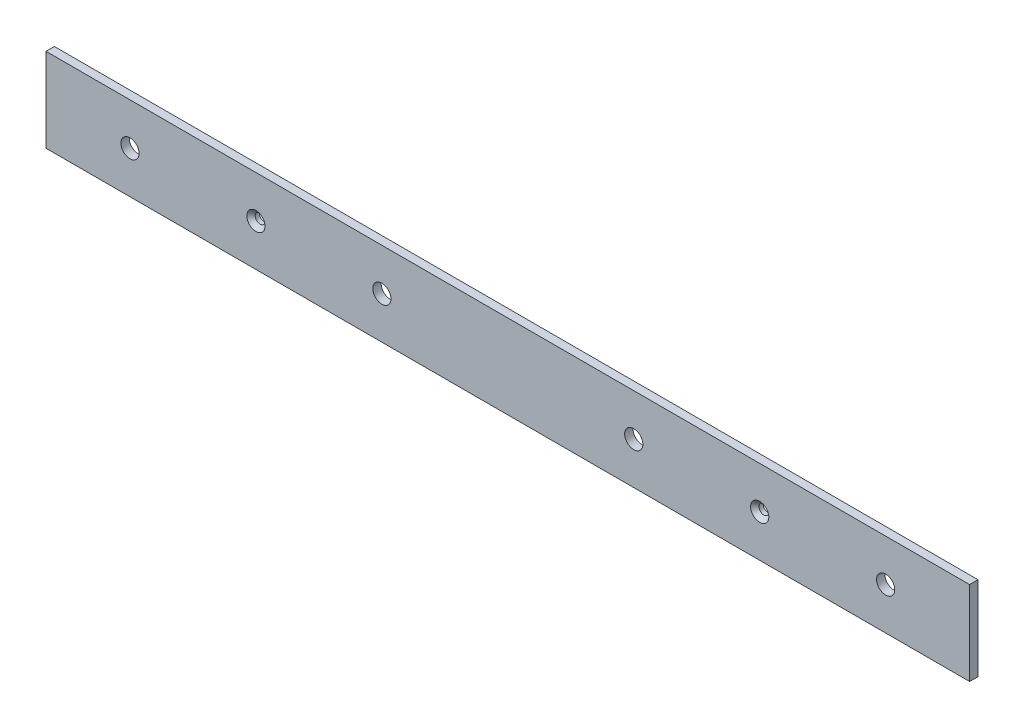
ISO-10303-21;
HEADER;
FILE_DESCRIPTION(('STEP AP214'),'2;1');
FILE_NAME('part.step','',(''),(''),'','','');
FILE_SCHEMA(('AUTOMOTIVE_DESIGN { 1 0 10303 214 1 1 1 1 }'));
ENDSEC;
DATA;
#1=APPLICATION_CONTEXT('core data for automotive mechanical design processes');
#2=APPLICATION_PROTOCOL_DEFINITION('international standard','automotive_design',2000,#1);
#3=PRODUCT_CONTEXT('',#1,'mechanical');
#4=PRODUCT('Part','Part','',(#3));
#5=PRODUCT_RELATED_PRODUCT_CATEGORY('part','',(#4));
#6=PRODUCT_DEFINITION_FORMATION('','',#4);
#7=PRODUCT_DEFINITION_CONTEXT('part definition',#1,'design');
#8=PRODUCT_DEFINITION('design','',#6,#7);
#9=PRODUCT_DEFINITION_SHAPE('','',#8);
#10=(LENGTH_UNIT() NAMED_UNIT(*) SI_UNIT(.MILLI.,.METRE.));
#11=(NAMED_UNIT(*) PLANE_ANGLE_UNIT() SI_UNIT($,.RADIAN.));
#12=(NAMED_UNIT(*) SI_UNIT($,.STERADIAN.) SOLID_ANGLE_UNIT());
#13=UNCERTAINTY_MEASURE_WITH_UNIT(LENGTH_MEASURE(1.E-05),#10,'distance_accuracy_value','');
#14=(GEOMETRIC_REPRESENTATION_CONTEXT(3) GLOBAL_UNCERTAINTY_ASSIGNED_CONTEXT((#13)) GLOBAL_UNIT_ASSIGNED_CONTEXT((#10,
#11,#12)) REPRESENTATION_CONTEXT('',''));
#15=CARTESIAN_POINT('',(0.,0.,0.));
#16=DIRECTION('',(0.,0.,1.));
#17=DIRECTION('',(1.,0.,0.));
#18=AXIS2_PLACEMENT_3D('',#15,#16,#17);
#19=CARTESIAN_POINT('',(-165.,-15.,3.));
#20=DIRECTION('',(0.,0.,-1.));
#21=DIRECTION('',(-1.,0.,0.));
#22=AXIS2_PLACEMENT_3D('',#19,#20,#21);
#23=PLANE('',#22);
#24=CARTESIAN_POINT('',(-90.,0.,3.));
#25=DIRECTION('',(0.,0.,-1.));
#26=DIRECTION('',(-1.,0.,0.));
#27=AXIS2_PLACEMENT_3D('',#24,#25,#26);
#28=CIRCLE('',#27,3.24999999999998);
#29=CARTESIAN_POINT('',(-93.25,0.,3.));
#30=VERTEX_POINT('',#29);
#31=EDGE_CURVE('E40',#30,#30,#28,.T.);
#32=ORIENTED_EDGE('',*,*,#31,.T.);
#33=EDGE_LOOP('',(#32));
#34=FACE_BOUND('',#33,.T.);
#35=CARTESIAN_POINT('',(90.,0.,3.));
#36=DIRECTION('',(0.,0.,-1.));
#37=DIRECTION('',(-1.,0.,0.));
#38=AXIS2_PLACEMENT_3D('',#35,#36,#37);
#39=CIRCLE('',#38,3.24999999999998);
#40=CARTESIAN_POINT('',(86.75,0.,3.));
#41=VERTEX_POINT('',#40);
#42=EDGE_CURVE('E112',#41,#41,#39,.T.);
#43=ORIENTED_EDGE('',*,*,#42,.T.);
#44=EDGE_LOOP('',(#43));
#45=FACE_BOUND('',#44,.T.);
#46=CARTESIAN_POINT('',(45.,0.,3.));
#47=DIRECTION('',(0.,0.,1.));
#48=DIRECTION('',(1.,0.,0.));
#49=AXIS2_PLACEMENT_3D('',#46,#47,#48);
#50=CIRCLE('',#49,3.25);
#51=CARTESIAN_POINT('',(48.25,0.,3.));
#52=VERTEX_POINT('',#51);
#53=EDGE_CURVE('E148',#52,#52,#50,.T.);
#54=ORIENTED_EDGE('',*,*,#53,.F.);
#55=EDGE_LOOP('',(#54));
#56=FACE_BOUND('',#55,.T.);
#57=CARTESIAN_POINT('',(135.,0.,3.));
#58=DIRECTION('',(0.,0.,1.));
#59=DIRECTION('',(1.,0.,0.));
#60=AXIS2_PLACEMENT_3D('',#57,#58,#59);
#61=CIRCLE('',#60,3.25000000000001);
#62=CARTESIAN_POINT('',(138.25,0.,3.));
#63=VERTEX_POINT('',#62);
#64=EDGE_CURVE('E102',#63,#63,#61,.T.);
#65=ORIENTED_EDGE('',*,*,#64,.F.);
#66=EDGE_LOOP('',(#65));
#67=FACE_BOUND('',#66,.T.);
#68=DIRECTION('',(0.,-1.,0.));
#69=VECTOR('',#68,1.);
#70=CARTESIAN_POINT('',(-165.,-15.,3.));
#71=LINE('',#70,#69);
#72=CARTESIAN_POINT('',(-165.,15.,3.));
#73=VERTEX_POINT('',#72);
#74=CARTESIAN_POINT('',(-165.,-15.,3.));
#75=VERTEX_POINT('',#74);
#76=EDGE_CURVE('E84',#73,#75,#71,.T.);
#77=ORIENTED_EDGE('',*,*,#76,.T.);
#78=DIRECTION('',(1.,0.,0.));
#79=VECTOR('',#78,1.);
#80=CARTESIAN_POINT('',(-165.,-15.,3.));
#81=LINE('',#80,#79);
#82=CARTESIAN_POINT('',(165.,-15.,3.));
#83=VERTEX_POINT('',#82);
#84=EDGE_CURVE('E79',#75,#83,#81,.T.);
#85=ORIENTED_EDGE('',*,*,#84,.T.);
#86=DIRECTION('',(0.,1.,0.));
#87=VECTOR('',#86,1.);
#88=CARTESIAN_POINT('',(165.,-15.,3.));
#89=LINE('',#88,#87);
#90=CARTESIAN_POINT('',(165.,15.,3.));
#91=VERTEX_POINT('',#90);
#92=EDGE_CURVE('E82',#83,#91,#89,.T.);
#93=ORIENTED_EDGE('',*,*,#92,.T.);
#94=DIRECTION('',(-1.,0.,0.));
#95=VECTOR('',#94,1.);
#96=CARTESIAN_POINT('',(-165.,15.,3.));
#97=LINE('',#96,#95);
#98=EDGE_CURVE('E48',#91,#73,#97,.T.);
#99=ORIENTED_EDGE('',*,*,#98,.T.);
#100=EDGE_LOOP('',(#77,#85,#93,#99));
#101=FACE_BOUND('',#100,.T.);
#102=CARTESIAN_POINT('',(-45.,0.,3.));
#103=DIRECTION('',(0.,0.,1.));
#104=DIRECTION('',(-1.,0.,0.));
#105=AXIS2_PLACEMENT_3D('',#102,#103,#104);
#106=CIRCLE('',#105,3.25);
#107=CARTESIAN_POINT('',(-48.25,0.,3.));
#108=VERTEX_POINT('',#107);
#109=EDGE_CURVE('E138',#108,#108,#106,.T.);
#110=ORIENTED_EDGE('',*,*,#109,.F.);
#111=EDGE_LOOP('',(#110));
#112=FACE_BOUND('',#111,.T.);
#113=CARTESIAN_POINT('',(-135.,0.,3.));
#114=DIRECTION('',(0.,0.,1.));
#115=DIRECTION('',(-1.,0.,0.));
#116=AXIS2_PLACEMENT_3D('',#113,#114,#115);
#117=CIRCLE('',#116,3.25000000000001);
#118=CARTESIAN_POINT('',(-138.25,0.,3.));
#119=VERTEX_POINT('',#118);
#120=EDGE_CURVE('E135',#119,#119,#117,.T.);
#121=ORIENTED_EDGE('',*,*,#120,.F.);
#122=EDGE_LOOP('',(#121));
#123=FACE_BOUND('',#122,.T.);
#124=ADVANCED_FACE('F31',(#34,#45,#56,#67,#101,#112,#123),#23,.F.);
#125=CARTESIAN_POINT('',(-165.,-15.,0.));
#126=DIRECTION('',(0.,0.,-1.));
#127=DIRECTION('',(-1.,0.,0.));
#128=AXIS2_PLACEMENT_3D('',#125,#126,#127);
#129=PLANE('',#128);
#130=CARTESIAN_POINT('',(-90.,0.,0.));
#131=DIRECTION('',(0.,0.,1.));
#132=DIRECTION('',(-1.,0.,0.));
#133=AXIS2_PLACEMENT_3D('',#130,#131,#132);
#134=CIRCLE('',#133,1.75);
#135=CARTESIAN_POINT('',(-91.75,0.,0.));
#136=VERTEX_POINT('',#135);
#137=EDGE_CURVE('E132',#136,#136,#134,.T.);
#138=ORIENTED_EDGE('',*,*,#137,.T.);
#139=EDGE_LOOP('',(#138));
#140=FACE_BOUND('',#139,.T.);
#141=CARTESIAN_POINT('',(45.,0.,0.));
#142=DIRECTION('',(0.,0.,1.));
#143=DIRECTION('',(1.,0.,0.));
#144=AXIS2_PLACEMENT_3D('',#141,#142,#143);
#145=CIRCLE('',#144,3.25);
#146=CARTESIAN_POINT('',(48.25,0.,0.));
#147=VERTEX_POINT('',#146);
#148=EDGE_CURVE('E146',#147,#147,#145,.T.);
#149=ORIENTED_EDGE('',*,*,#148,.T.);
#150=EDGE_LOOP('',(#149));
#151=FACE_BOUND('',#150,.T.);
#152=CARTESIAN_POINT('',(135.,0.,0.));
#153=DIRECTION('',(0.,0.,1.));
#154=DIRECTION('',(1.,0.,0.));
#155=AXIS2_PLACEMENT_3D('',#152,#153,#154);
#156=CIRCLE('',#155,3.25000000000001);
#157=CARTESIAN_POINT('',(138.25,0.,0.));
#158=VERTEX_POINT('',#157);
#159=EDGE_CURVE('E156',#158,#158,#156,.T.);
#160=ORIENTED_EDGE('',*,*,#159,.T.);
#161=EDGE_LOOP('',(#160));
#162=FACE_BOUND('',#161,.T.);
#163=DIRECTION('',(0.,-1.,0.));
#164=VECTOR('',#163,1.);
#165=CARTESIAN_POINT('',(-165.,-15.,0.));
#166=LINE('',#165,#164);
#167=CARTESIAN_POINT('',(-165.,15.,0.));
#168=VERTEX_POINT('',#167);
#169=CARTESIAN_POINT('',(-165.,-15.,0.));
#170=VERTEX_POINT('',#169);
#171=EDGE_CURVE('E99',#168,#170,#166,.T.);
#172=ORIENTED_EDGE('',*,*,#171,.F.);
#173=DIRECTION('',(-1.,0.,0.));
#174=VECTOR('',#173,1.);
#175=CARTESIAN_POINT('',(-165.,15.,0.));
#176=LINE('',#175,#174);
#177=CARTESIAN_POINT('',(165.,15.,0.));
#178=VERTEX_POINT('',#177);
#179=EDGE_CURVE('E71',#178,#168,#176,.T.);
#180=ORIENTED_EDGE('',*,*,#179,.F.);
#181=DIRECTION('',(0.,1.,0.));
#182=VECTOR('',#181,1.);
#183=CARTESIAN_POINT('',(165.,-15.,0.));
#184=LINE('',#183,#182);
#185=CARTESIAN_POINT('',(165.,-15.,0.));
#186=VERTEX_POINT('',#185);
#187=EDGE_CURVE('E65',#186,#178,#184,.T.);
#188=ORIENTED_EDGE('',*,*,#187,.F.);
#189=DIRECTION('',(1.,0.,0.));
#190=VECTOR('',#189,1.);
#191=CARTESIAN_POINT('',(-165.,-15.,0.));
#192=LINE('',#191,#190);
#193=EDGE_CURVE('E89',#170,#186,#192,.T.);
#194=ORIENTED_EDGE('',*,*,#193,.F.);
#195=EDGE_LOOP('',(#172,#180,#188,#194));
#196=FACE_BOUND('',#195,.T.);
#197=CARTESIAN_POINT('',(90.,0.,0.));
#198=DIRECTION('',(0.,0.,1.));
#199=DIRECTION('',(1.,0.,0.));
#200=AXIS2_PLACEMENT_3D('',#197,#198,#199);
#201=CIRCLE('',#200,1.75);
#202=CARTESIAN_POINT('',(91.75,0.,0.));
#203=VERTEX_POINT('',#202);
#204=EDGE_CURVE('E151',#203,#203,#201,.T.);
#205=ORIENTED_EDGE('',*,*,#204,.T.);
#206=EDGE_LOOP('',(#205));
#207=FACE_BOUND('',#206,.T.);
#208=CARTESIAN_POINT('',(-45.,0.,0.));
#209=DIRECTION('',(0.,0.,1.));
#210=DIRECTION('',(-1.,0.,0.));
#211=AXIS2_PLACEMENT_3D('',#208,#209,#210);
#212=CIRCLE('',#211,3.25);
#213=CARTESIAN_POINT('',(-48.25,0.,0.));
#214=VERTEX_POINT('',#213);
#215=EDGE_CURVE('E134',#214,#214,#212,.T.);
#216=ORIENTED_EDGE('',*,*,#215,.T.);
#217=EDGE_LOOP('',(#216));
#218=FACE_BOUND('',#217,.T.);
#219=CARTESIAN_POINT('',(-135.,0.,0.));
#220=DIRECTION('',(0.,0.,1.));
#221=DIRECTION('',(-1.,0.,0.));
#222=AXIS2_PLACEMENT_3D('',#219,#220,#221);
#223=CIRCLE('',#222,3.25000000000001);
#224=CARTESIAN_POINT('',(-138.25,0.,0.));
#225=VERTEX_POINT('',#224);
#226=EDGE_CURVE('E141',#225,#225,#223,.T.);
#227=ORIENTED_EDGE('',*,*,#226,.T.);
#228=EDGE_LOOP('',(#227));
#229=FACE_BOUND('',#228,.T.);
#230=ADVANCED_FACE('F162',(#140,#151,#162,#196,#207,#218,#229),#129,.T.);
#231=CARTESIAN_POINT('',(-165.,-15.,3.));
#232=DIRECTION('',(1.,0.,0.));
#233=DIRECTION('',(0.,0.,-1.));
#234=AXIS2_PLACEMENT_3D('',#231,#232,#233);
#235=PLANE('',#234);
#236=ORIENTED_EDGE('',*,*,#171,.T.);
#237=DIRECTION('',(0.,0.,-1.));
#238=VECTOR('',#237,1.);
#239=CARTESIAN_POINT('',(-165.,-15.,3.));
#240=LINE('',#239,#238);
#241=EDGE_CURVE('E90',#75,#170,#240,.T.);
#242=ORIENTED_EDGE('',*,*,#241,.F.);
#243=ORIENTED_EDGE('',*,*,#76,.F.);
#244=DIRECTION('',(0.,0.,-1.));
#245=VECTOR('',#244,1.);
#246=CARTESIAN_POINT('',(-165.,15.,3.));
#247=LINE('',#246,#245);
#248=EDGE_CURVE('E95',#73,#168,#247,.T.);
#249=ORIENTED_EDGE('',*,*,#248,.T.);
#250=EDGE_LOOP('',(#236,#242,#243,#249));
#251=FACE_BOUND('',#250,.T.);
#252=ADVANCED_FACE('F184',(#251),#235,.F.);
#253=CARTESIAN_POINT('',(-165.,-15.,3.));
#254=DIRECTION('',(0.,1.,0.));
#255=DIRECTION('',(0.,0.,1.));
#256=AXIS2_PLACEMENT_3D('',#253,#254,#255);
#257=PLANE('',#256);
#258=ORIENTED_EDGE('',*,*,#193,.T.);
#259=DIRECTION('',(0.,0.,-1.));
#260=VECTOR('',#259,1.);
#261=CARTESIAN_POINT('',(165.,-15.,3.));
#262=LINE('',#261,#260);
#263=EDGE_CURVE('E87',#83,#186,#262,.T.);
#264=ORIENTED_EDGE('',*,*,#263,.F.);
#265=ORIENTED_EDGE('',*,*,#84,.F.);
#266=ORIENTED_EDGE('',*,*,#241,.T.);
#267=EDGE_LOOP('',(#258,#264,#265,#266));
#268=FACE_BOUND('',#267,.T.);
#269=ADVANCED_FACE('F88',(#268),#257,.F.);
#270=CARTESIAN_POINT('',(165.,-15.,3.));
#271=DIRECTION('',(-1.,0.,0.));
#272=DIRECTION('',(0.,0.,1.));
#273=AXIS2_PLACEMENT_3D('',#270,#271,#272);
#274=PLANE('',#273);
#275=ORIENTED_EDGE('',*,*,#187,.T.);
#276=DIRECTION('',(0.,0.,-1.));
#277=VECTOR('',#276,1.);
#278=CARTESIAN_POINT('',(165.,15.,3.));
#279=LINE('',#278,#277);
#280=EDGE_CURVE('E91',#91,#178,#279,.T.);
#281=ORIENTED_EDGE('',*,*,#280,.F.);
#282=ORIENTED_EDGE('',*,*,#92,.F.);
#283=ORIENTED_EDGE('',*,*,#263,.T.);
#284=EDGE_LOOP('',(#275,#281,#282,#283));
#285=FACE_BOUND('',#284,.T.);
#286=ADVANCED_FACE('F93',(#285),#274,.F.);
#287=CARTESIAN_POINT('',(-165.,15.,3.));
#288=DIRECTION('',(0.,-1.,0.));
#289=DIRECTION('',(1.,0.,0.));
#290=AXIS2_PLACEMENT_3D('',#287,#288,#289);
#291=PLANE('',#290);
#292=ORIENTED_EDGE('',*,*,#179,.T.);
#293=ORIENTED_EDGE('',*,*,#248,.F.);
#294=ORIENTED_EDGE('',*,*,#98,.F.);
#295=ORIENTED_EDGE('',*,*,#280,.T.);
#296=EDGE_LOOP('',(#292,#293,#294,#295));
#297=FACE_BOUND('',#296,.T.);
#298=ADVANCED_FACE('F168',(#297),#291,.F.);
#299=CARTESIAN_POINT('',(135.,0.,3.));
#300=DIRECTION('',(0.,0.,-1.));
#301=DIRECTION('',(-1.,0.,0.));
#302=AXIS2_PLACEMENT_3D('',#299,#300,#301);
#303=CYLINDRICAL_SURFACE('',#302,3.25000000000001);
#304=ORIENTED_EDGE('',*,*,#64,.T.);
#305=EDGE_LOOP('',(#304));
#306=FACE_BOUND('',#305,.T.);
#307=ORIENTED_EDGE('',*,*,#159,.F.);
#308=EDGE_LOOP('',(#307));
#309=FACE_BOUND('',#308,.T.);
#310=ADVANCED_FACE('F165',(#306,#309),#303,.F.);
#311=CARTESIAN_POINT('',(90.,0.,3.));
#312=DIRECTION('',(0.,0.,-1.));
#313=DIRECTION('',(-1.,0.,0.));
#314=AXIS2_PLACEMENT_3D('',#311,#312,#313);
#315=CYLINDRICAL_SURFACE('',#314,1.75);
#316=CARTESIAN_POINT('',(90.,0.,1.50000000000002));
#317=DIRECTION('',(0.,0.,-1.));
#318=DIRECTION('',(-1.,0.,0.));
#319=AXIS2_PLACEMENT_3D('',#316,#317,#318);
#320=CIRCLE('',#319,1.75);
#321=CARTESIAN_POINT('',(88.25,0.,1.50000000000002));
#322=VERTEX_POINT('',#321);
#323=EDGE_CURVE('E11',#322,#322,#320,.F.);
#324=ORIENTED_EDGE('',*,*,#323,.T.);
#325=EDGE_LOOP('',(#324));
#326=FACE_BOUND('',#325,.T.);
#327=ORIENTED_EDGE('',*,*,#204,.F.);
#328=EDGE_LOOP('',(#327));
#329=FACE_BOUND('',#328,.T.);
#330=ADVANCED_FACE('F167',(#326,#329),#315,.F.);
#331=CARTESIAN_POINT('',(45.,0.,3.));
#332=DIRECTION('',(0.,0.,-1.));
#333=DIRECTION('',(-1.,0.,0.));
#334=AXIS2_PLACEMENT_3D('',#331,#332,#333);
#335=CYLINDRICAL_SURFACE('',#334,3.25);
#336=ORIENTED_EDGE('',*,*,#53,.T.);
#337=EDGE_LOOP('',(#336));
#338=FACE_BOUND('',#337,.T.);
#339=ORIENTED_EDGE('',*,*,#148,.F.);
#340=EDGE_LOOP('',(#339));
#341=FACE_BOUND('',#340,.T.);
#342=ADVANCED_FACE('F175',(#338,#341),#335,.F.);
#343=CARTESIAN_POINT('',(-45.,0.,3.));
#344=DIRECTION('',(0.,0.,-1.));
#345=DIRECTION('',(-1.,0.,0.));
#346=AXIS2_PLACEMENT_3D('',#343,#344,#345);
#347=CYLINDRICAL_SURFACE('',#346,3.25);
#348=ORIENTED_EDGE('',*,*,#109,.T.);
#349=EDGE_LOOP('',(#348));
#350=FACE_BOUND('',#349,.T.);
#351=ORIENTED_EDGE('',*,*,#215,.F.);
#352=EDGE_LOOP('',(#351));
#353=FACE_BOUND('',#352,.T.);
#354=ADVANCED_FACE('F128',(#350,#353),#347,.F.);
#355=CARTESIAN_POINT('',(-90.,0.,3.));
#356=DIRECTION('',(0.,0.,-1.));
#357=DIRECTION('',(-1.,0.,0.));
#358=AXIS2_PLACEMENT_3D('',#355,#356,#357);
#359=CYLINDRICAL_SURFACE('',#358,1.75);
#360=CARTESIAN_POINT('',(-90.,0.,1.50000000000002));
#361=DIRECTION('',(0.,0.,-1.));
#362=DIRECTION('',(-1.,0.,0.));
#363=AXIS2_PLACEMENT_3D('',#360,#361,#362);
#364=CIRCLE('',#363,1.75);
#365=CARTESIAN_POINT('',(-91.75,0.,1.50000000000002));
#366=VERTEX_POINT('',#365);
#367=EDGE_CURVE('E109',#366,#366,#364,.F.);
#368=ORIENTED_EDGE('',*,*,#367,.T.);
#369=EDGE_LOOP('',(#368));
#370=FACE_BOUND('',#369,.T.);
#371=ORIENTED_EDGE('',*,*,#137,.F.);
#372=EDGE_LOOP('',(#371));
#373=FACE_BOUND('',#372,.T.);
#374=ADVANCED_FACE('F125',(#370,#373),#359,.F.);
#375=CARTESIAN_POINT('',(-135.,0.,3.));
#376=DIRECTION('',(0.,0.,-1.));
#377=DIRECTION('',(-1.,0.,0.));
#378=AXIS2_PLACEMENT_3D('',#375,#376,#377);
#379=CYLINDRICAL_SURFACE('',#378,3.25000000000001);
#380=ORIENTED_EDGE('',*,*,#120,.T.);
#381=EDGE_LOOP('',(#380));
#382=FACE_BOUND('',#381,.T.);
#383=ORIENTED_EDGE('',*,*,#226,.F.);
#384=EDGE_LOOP('',(#383));
#385=FACE_BOUND('',#384,.T.);
#386=ADVANCED_FACE('F122',(#382,#385),#379,.F.);
#387=CARTESIAN_POINT('',(-90.,0.,1.50000000000002));
#388=DIRECTION('',(0.,0.,1.));
#389=DIRECTION('',(1.,0.,0.));
#390=AXIS2_PLACEMENT_3D('',#387,#388,#389);
#391=CONICAL_SURFACE('',#390,1.75,0.785398163397446);
#392=ORIENTED_EDGE('',*,*,#31,.F.);
#393=EDGE_LOOP('',(#392));
#394=FACE_BOUND('',#393,.T.);
#395=ORIENTED_EDGE('',*,*,#367,.F.);
#396=EDGE_LOOP('',(#395));
#397=FACE_BOUND('',#396,.T.);
#398=ADVANCED_FACE('F119',(#394,#397),#391,.F.);
#399=CARTESIAN_POINT('',(90.,0.,1.50000000000002));
#400=DIRECTION('',(0.,0.,1.));
#401=DIRECTION('',(1.,0.,0.));
#402=AXIS2_PLACEMENT_3D('',#399,#400,#401);
#403=CONICAL_SURFACE('',#402,1.75,0.785398163397446);
#404=ORIENTED_EDGE('',*,*,#42,.F.);
#405=EDGE_LOOP('',(#404));
#406=FACE_BOUND('',#405,.T.);
#407=ORIENTED_EDGE('',*,*,#323,.F.);
#408=EDGE_LOOP('',(#407));
#409=FACE_BOUND('',#408,.T.);
#410=ADVANCED_FACE('F33',(#406,#409),#403,.F.);
#411=CLOSED_SHELL('',(#124,#230,#252,#269,#286,#298,#310,#330,#342,#354,#374,#386,#398,#410));
#412=MANIFOLD_SOLID_BREP('B2',#411);
#413=ADVANCED_BREP_SHAPE_REPRESENTATION('',(#18,#412),#14);
#414=SHAPE_DEFINITION_REPRESENTATION(#9,#413);
ENDSEC;
END-ISO-10303-21;
